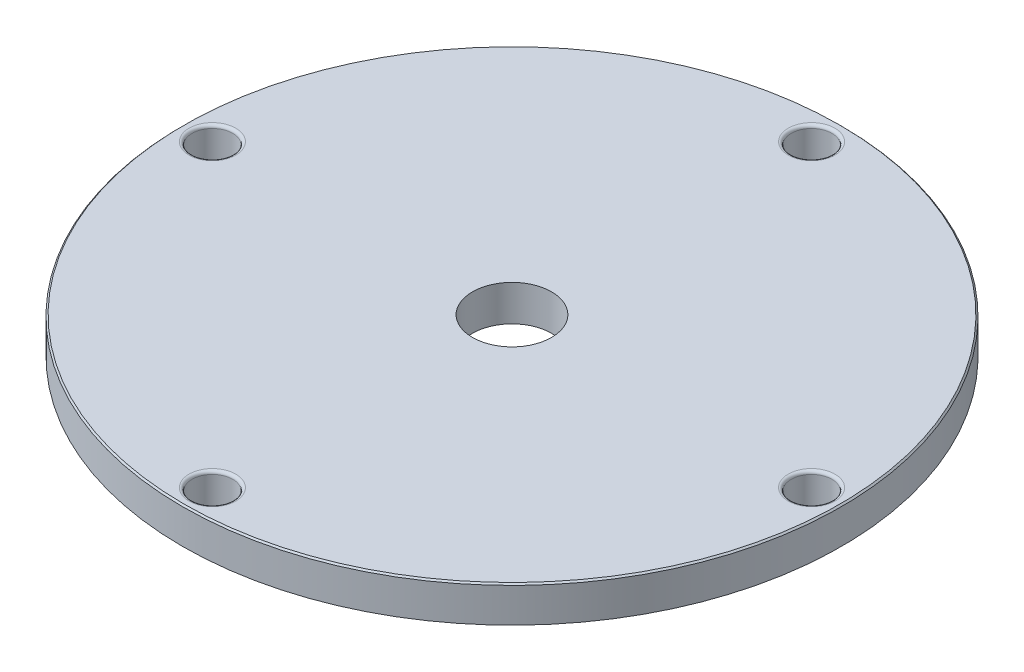
ISO-10303-21;
HEADER;
FILE_DESCRIPTION(('STEP AP214'),'2;1');
FILE_NAME('part.step','',(''),(''),'','','');
FILE_SCHEMA(('AUTOMOTIVE_DESIGN { 1 0 10303 214 1 1 1 1 }'));
ENDSEC;
DATA;
#1=APPLICATION_CONTEXT('core data for automotive mechanical design processes');
#2=APPLICATION_PROTOCOL_DEFINITION('international standard','automotive_design',2000,#1);
#3=PRODUCT_CONTEXT('',#1,'mechanical');
#4=PRODUCT('Part','Part','',(#3));
#5=PRODUCT_RELATED_PRODUCT_CATEGORY('part','',(#4));
#6=PRODUCT_DEFINITION_FORMATION('','',#4);
#7=PRODUCT_DEFINITION_CONTEXT('part definition',#1,'design');
#8=PRODUCT_DEFINITION('design','',#6,#7);
#9=PRODUCT_DEFINITION_SHAPE('','',#8);
#10=(LENGTH_UNIT() NAMED_UNIT(*) SI_UNIT(.MILLI.,.METRE.));
#11=(NAMED_UNIT(*) PLANE_ANGLE_UNIT() SI_UNIT($,.RADIAN.));
#12=(NAMED_UNIT(*) SI_UNIT($,.STERADIAN.) SOLID_ANGLE_UNIT());
#13=UNCERTAINTY_MEASURE_WITH_UNIT(LENGTH_MEASURE(1.E-05),#10,'distance_accuracy_value','');
#14=(GEOMETRIC_REPRESENTATION_CONTEXT(3) GLOBAL_UNCERTAINTY_ASSIGNED_CONTEXT((#13)) GLOBAL_UNIT_ASSIGNED_CONTEXT((#10,
#11,#12)) REPRESENTATION_CONTEXT('',''));
#15=CARTESIAN_POINT('',(0.,0.,0.));
#16=DIRECTION('',(0.,0.,1.));
#17=DIRECTION('',(1.,0.,0.));
#18=AXIS2_PLACEMENT_3D('',#15,#16,#17);
#19=CARTESIAN_POINT('',(0.,3.,0.));
#20=DIRECTION('',(0.,-1.,0.));
#21=DIRECTION('',(0.,0.,-1.));
#22=AXIS2_PLACEMENT_3D('',#19,#20,#21);
#23=CYLINDRICAL_SURFACE('',#22,3.3);
#24=CARTESIAN_POINT('',(0.,3.,0.));
#25=DIRECTION('',(0.,1.,0.));
#26=DIRECTION('',(0.,0.,1.));
#27=AXIS2_PLACEMENT_3D('',#24,#25,#26);
#28=CIRCLE('',#27,3.3);
#29=CARTESIAN_POINT('',(0.,3.,3.3));
#30=VERTEX_POINT('',#29);
#31=EDGE_CURVE('E86',#30,#30,#28,.T.);
#32=ORIENTED_EDGE('',*,*,#31,.T.);
#33=EDGE_LOOP('',(#32));
#34=FACE_BOUND('',#33,.T.);
#35=CARTESIAN_POINT('',(0.,0.,0.));
#36=DIRECTION('',(0.,1.,0.));
#37=DIRECTION('',(0.,0.,1.));
#38=AXIS2_PLACEMENT_3D('',#35,#36,#37);
#39=CIRCLE('',#38,3.3);
#40=CARTESIAN_POINT('',(0.,0.,3.3));
#41=VERTEX_POINT('',#40);
#42=EDGE_CURVE('E91',#41,#41,#39,.T.);
#43=ORIENTED_EDGE('',*,*,#42,.F.);
#44=EDGE_LOOP('',(#43));
#45=FACE_BOUND('',#44,.T.);
#46=ADVANCED_FACE('F38',(#34,#45),#23,.F.);
#47=CARTESIAN_POINT('',(0.,3.,0.));
#48=DIRECTION('',(0.,-1.,0.));
#49=DIRECTION('',(0.,0.,-1.));
#50=AXIS2_PLACEMENT_3D('',#47,#48,#49);
#51=CYLINDRICAL_SURFACE('',#50,27.5);
#52=CARTESIAN_POINT('',(0.,2.87500000000001,0.));
#53=DIRECTION('',(0.,1.,0.));
#54=DIRECTION('',(0.,0.,1.));
#55=AXIS2_PLACEMENT_3D('',#52,#53,#54);
#56=CIRCLE('',#55,27.5);
#57=CARTESIAN_POINT('',(0.,2.87500000000001,27.5));
#58=VERTEX_POINT('',#57);
#59=EDGE_CURVE('E78',#58,#58,#56,.F.);
#60=ORIENTED_EDGE('',*,*,#59,.T.);
#61=EDGE_LOOP('',(#60));
#62=FACE_BOUND('',#61,.T.);
#63=CARTESIAN_POINT('',(0.,0.,0.));
#64=DIRECTION('',(0.,1.,0.));
#65=DIRECTION('',(0.,0.,1.));
#66=AXIS2_PLACEMENT_3D('',#63,#64,#65);
#67=CIRCLE('',#66,27.5);
#68=CARTESIAN_POINT('',(0.,0.,27.5));
#69=VERTEX_POINT('',#68);
#70=EDGE_CURVE('E87',#69,#69,#67,.T.);
#71=ORIENTED_EDGE('',*,*,#70,.T.);
#72=EDGE_LOOP('',(#71));
#73=FACE_BOUND('',#72,.T.);
#74=ADVANCED_FACE('F135',(#62,#73),#51,.T.);
#75=CARTESIAN_POINT('',(0.,3.,0.));
#76=DIRECTION('',(0.,1.,0.));
#77=DIRECTION('',(0.,0.,1.));
#78=AXIS2_PLACEMENT_3D('',#75,#76,#77);
#79=PLANE('',#78);
#80=CARTESIAN_POINT('',(-24.9999999999993,3.,7.09011927261166E-13));
#81=DIRECTION('',(0.,1.,0.));
#82=DIRECTION('',(0.,0.,1.));
#83=AXIS2_PLACEMENT_3D('',#80,#81,#82);
#84=CIRCLE('',#83,1.95000000000113);
#85=CARTESIAN_POINT('',(-24.9999999999993,3.,1.95000000000184));
#86=VERTEX_POINT('',#85);
#87=EDGE_CURVE('E56',#86,#86,#84,.F.);
#88=ORIENTED_EDGE('',*,*,#87,.T.);
#89=EDGE_LOOP('',(#88));
#90=FACE_BOUND('',#89,.T.);
#91=CARTESIAN_POINT('',(1.4119006205266E-12,3.,25.));
#92=DIRECTION('',(0.,1.,0.));
#93=DIRECTION('',(0.,0.,1.));
#94=AXIS2_PLACEMENT_3D('',#91,#92,#93);
#95=CIRCLE('',#94,1.95000000000152);
#96=CARTESIAN_POINT('',(1.4119006205266E-12,3.,26.9500000000015));
#97=VERTEX_POINT('',#96);
#98=EDGE_CURVE('E62',#97,#97,#95,.F.);
#99=ORIENTED_EDGE('',*,*,#98,.T.);
#100=EDGE_LOOP('',(#99));
#101=FACE_BOUND('',#100,.T.);
#102=CARTESIAN_POINT('',(25.0000000000007,3.,-7.05950310263298E-13));
#103=DIRECTION('',(0.,1.,0.));
#104=DIRECTION('',(0.,0.,1.));
#105=AXIS2_PLACEMENT_3D('',#102,#103,#104);
#106=CIRCLE('',#105,1.95000000000055);
#107=CARTESIAN_POINT('',(25.0000000000007,3.,1.94999999999985));
#108=VERTEX_POINT('',#107);
#109=EDGE_CURVE('E66',#108,#108,#106,.F.);
#110=ORIENTED_EDGE('',*,*,#109,.T.);
#111=EDGE_LOOP('',(#110));
#112=FACE_BOUND('',#111,.T.);
#113=CARTESIAN_POINT('',(0.,3.,-25.));
#114=DIRECTION('',(0.,1.,0.));
#115=DIRECTION('',(0.,0.,1.));
#116=AXIS2_PLACEMENT_3D('',#113,#114,#115);
#117=CIRCLE('',#116,1.95);
#118=CARTESIAN_POINT('',(0.,3.,-23.05));
#119=VERTEX_POINT('',#118);
#120=EDGE_CURVE('E70',#119,#119,#117,.F.);
#121=ORIENTED_EDGE('',*,*,#120,.T.);
#122=EDGE_LOOP('',(#121));
#123=FACE_BOUND('',#122,.T.);
#124=CARTESIAN_POINT('',(0.,3.,0.));
#125=DIRECTION('',(0.,1.,0.));
#126=DIRECTION('',(0.,0.,1.));
#127=AXIS2_PLACEMENT_3D('',#124,#125,#126);
#128=CIRCLE('',#127,27.375);
#129=CARTESIAN_POINT('',(0.,3.,27.375));
#130=VERTEX_POINT('',#129);
#131=EDGE_CURVE('E82',#130,#130,#128,.T.);
#132=ORIENTED_EDGE('',*,*,#131,.T.);
#133=EDGE_LOOP('',(#132));
#134=FACE_BOUND('',#133,.T.);
#135=ORIENTED_EDGE('',*,*,#31,.F.);
#136=EDGE_LOOP('',(#135));
#137=FACE_BOUND('',#136,.T.);
#138=ADVANCED_FACE('F141',(#90,#101,#112,#123,#134,#137),#79,.T.);
#139=CARTESIAN_POINT('',(0.,0.,0.));
#140=DIRECTION('',(0.,1.,0.));
#141=DIRECTION('',(0.,0.,1.));
#142=AXIS2_PLACEMENT_3D('',#139,#140,#141);
#143=PLANE('',#142);
#144=CARTESIAN_POINT('',(-24.9999999999993,0.,7.09011927261166E-13));
#145=DIRECTION('',(0.,1.,0.));
#146=DIRECTION('',(0.,0.,1.));
#147=AXIS2_PLACEMENT_3D('',#144,#145,#146);
#148=CIRCLE('',#147,1.70000000000113);
#149=CARTESIAN_POINT('',(-24.9999999999993,0.,1.70000000000184));
#150=VERTEX_POINT('',#149);
#151=EDGE_CURVE('E95',#150,#150,#148,.T.);
#152=ORIENTED_EDGE('',*,*,#151,.T.);
#153=EDGE_LOOP('',(#152));
#154=FACE_BOUND('',#153,.T.);
#155=CARTESIAN_POINT('',(1.4119006205266E-12,0.,25.));
#156=DIRECTION('',(0.,1.,0.));
#157=DIRECTION('',(0.,0.,1.));
#158=AXIS2_PLACEMENT_3D('',#155,#156,#157);
#159=CIRCLE('',#158,1.70000000000152);
#160=CARTESIAN_POINT('',(1.4119006205266E-12,0.,26.7000000000015));
#161=VERTEX_POINT('',#160);
#162=EDGE_CURVE('E107',#161,#161,#159,.T.);
#163=ORIENTED_EDGE('',*,*,#162,.T.);
#164=EDGE_LOOP('',(#163));
#165=FACE_BOUND('',#164,.T.);
#166=CARTESIAN_POINT('',(25.0000000000007,0.,-7.05950310263298E-13));
#167=DIRECTION('',(0.,1.,0.));
#168=DIRECTION('',(0.,0.,1.));
#169=AXIS2_PLACEMENT_3D('',#166,#167,#168);
#170=CIRCLE('',#169,1.70000000000055);
#171=CARTESIAN_POINT('',(25.0000000000007,0.,1.69999999999985));
#172=VERTEX_POINT('',#171);
#173=EDGE_CURVE('E103',#172,#172,#170,.T.);
#174=ORIENTED_EDGE('',*,*,#173,.T.);
#175=EDGE_LOOP('',(#174));
#176=FACE_BOUND('',#175,.T.);
#177=CARTESIAN_POINT('',(0.,0.,-25.));
#178=DIRECTION('',(0.,1.,0.));
#179=DIRECTION('',(0.,0.,1.));
#180=AXIS2_PLACEMENT_3D('',#177,#178,#179);
#181=CIRCLE('',#180,1.7);
#182=CARTESIAN_POINT('',(0.,0.,-23.3));
#183=VERTEX_POINT('',#182);
#184=EDGE_CURVE('E99',#183,#183,#181,.T.);
#185=ORIENTED_EDGE('',*,*,#184,.T.);
#186=EDGE_LOOP('',(#185));
#187=FACE_BOUND('',#186,.T.);
#188=ORIENTED_EDGE('',*,*,#42,.T.);
#189=EDGE_LOOP('',(#188));
#190=FACE_BOUND('',#189,.T.);
#191=ORIENTED_EDGE('',*,*,#70,.F.);
#192=EDGE_LOOP('',(#191));
#193=FACE_BOUND('',#192,.T.);
#194=ADVANCED_FACE('F115',(#154,#165,#176,#187,#190,#193),#143,.F.);
#195=CARTESIAN_POINT('',(0.,0.,-25.));
#196=DIRECTION('',(0.,1.,0.));
#197=DIRECTION('',(0.,0.,1.));
#198=AXIS2_PLACEMENT_3D('',#195,#196,#197);
#199=CYLINDRICAL_SURFACE('',#198,1.7);
#200=CARTESIAN_POINT('',(0.,2.75,-25.));
#201=DIRECTION('',(0.,1.,0.));
#202=DIRECTION('',(0.,0.,1.));
#203=AXIS2_PLACEMENT_3D('',#200,#201,#202);
#204=CIRCLE('',#203,1.7);
#205=CARTESIAN_POINT('',(0.,2.75,-23.3));
#206=VERTEX_POINT('',#205);
#207=EDGE_CURVE('E10',#206,#206,#204,.T.);
#208=ORIENTED_EDGE('',*,*,#207,.T.);
#209=EDGE_LOOP('',(#208));
#210=FACE_BOUND('',#209,.T.);
#211=ORIENTED_EDGE('',*,*,#184,.F.);
#212=EDGE_LOOP('',(#211));
#213=FACE_BOUND('',#212,.T.);
#214=ADVANCED_FACE('F180',(#210,#213),#199,.F.);
#215=CARTESIAN_POINT('',(25.0000000000007,0.,-7.05950310263298E-13));
#216=DIRECTION('',(0.,1.,0.));
#217=DIRECTION('',(0.,0.,1.));
#218=AXIS2_PLACEMENT_3D('',#215,#216,#217);
#219=CYLINDRICAL_SURFACE('',#218,1.70000000000055);
#220=CARTESIAN_POINT('',(25.0000000000007,2.75,-7.05950310263298E-13));
#221=DIRECTION('',(0.,1.,0.));
#222=DIRECTION('',(0.,0.,1.));
#223=AXIS2_PLACEMENT_3D('',#220,#221,#222);
#224=CIRCLE('',#223,1.70000000000055);
#225=CARTESIAN_POINT('',(25.0000000000007,2.75,1.69999999999985));
#226=VERTEX_POINT('',#225);
#227=EDGE_CURVE('E46',#226,#226,#224,.T.);
#228=ORIENTED_EDGE('',*,*,#227,.T.);
#229=EDGE_LOOP('',(#228));
#230=FACE_BOUND('',#229,.T.);
#231=ORIENTED_EDGE('',*,*,#173,.F.);
#232=EDGE_LOOP('',(#231));
#233=FACE_BOUND('',#232,.T.);
#234=ADVANCED_FACE('F131',(#230,#233),#219,.F.);
#235=CARTESIAN_POINT('',(1.4119006205266E-12,0.,25.));
#236=DIRECTION('',(0.,1.,0.));
#237=DIRECTION('',(0.,0.,1.));
#238=AXIS2_PLACEMENT_3D('',#235,#236,#237);
#239=CYLINDRICAL_SURFACE('',#238,1.70000000000152);
#240=CARTESIAN_POINT('',(1.4119006205266E-12,2.75,25.));
#241=DIRECTION('',(0.,1.,0.));
#242=DIRECTION('',(0.,0.,1.));
#243=AXIS2_PLACEMENT_3D('',#240,#241,#242);
#244=CIRCLE('',#243,1.70000000000152);
#245=CARTESIAN_POINT('',(1.4119006205266E-12,2.75,26.7000000000015));
#246=VERTEX_POINT('',#245);
#247=EDGE_CURVE('E51',#246,#246,#244,.T.);
#248=ORIENTED_EDGE('',*,*,#247,.T.);
#249=EDGE_LOOP('',(#248));
#250=FACE_BOUND('',#249,.T.);
#251=ORIENTED_EDGE('',*,*,#162,.F.);
#252=EDGE_LOOP('',(#251));
#253=FACE_BOUND('',#252,.T.);
#254=ADVANCED_FACE('F121',(#250,#253),#239,.F.);
#255=CARTESIAN_POINT('',(-24.9999999999993,0.,7.09011927261166E-13));
#256=DIRECTION('',(0.,1.,0.));
#257=DIRECTION('',(0.,0.,1.));
#258=AXIS2_PLACEMENT_3D('',#255,#256,#257);
#259=CYLINDRICAL_SURFACE('',#258,1.70000000000113);
#260=CARTESIAN_POINT('',(-24.9999999999993,2.75,7.09011927261166E-13));
#261=DIRECTION('',(0.,1.,0.));
#262=DIRECTION('',(0.,0.,1.));
#263=AXIS2_PLACEMENT_3D('',#260,#261,#262);
#264=CIRCLE('',#263,1.70000000000113);
#265=CARTESIAN_POINT('',(-24.9999999999993,2.75,1.70000000000184));
#266=VERTEX_POINT('',#265);
#267=EDGE_CURVE('E74',#266,#266,#264,.T.);
#268=ORIENTED_EDGE('',*,*,#267,.T.);
#269=EDGE_LOOP('',(#268));
#270=FACE_BOUND('',#269,.T.);
#271=ORIENTED_EDGE('',*,*,#151,.F.);
#272=EDGE_LOOP('',(#271));
#273=FACE_BOUND('',#272,.T.);
#274=ADVANCED_FACE('F118',(#270,#273),#259,.F.);
#275=CARTESIAN_POINT('',(0.,3.,0.));
#276=DIRECTION('',(0.,-1.,0.));
#277=DIRECTION('',(0.,0.,-1.));
#278=AXIS2_PLACEMENT_3D('',#275,#276,#277);
#279=CONICAL_SURFACE('',#278,27.375,0.785398163397476);
#280=ORIENTED_EDGE('',*,*,#59,.F.);
#281=EDGE_LOOP('',(#280));
#282=FACE_BOUND('',#281,.T.);
#283=ORIENTED_EDGE('',*,*,#131,.F.);
#284=EDGE_LOOP('',(#283));
#285=FACE_BOUND('',#284,.T.);
#286=ADVANCED_FACE('F120',(#282,#285),#279,.T.);
#287=CARTESIAN_POINT('',(-24.9999999999993,2.75,7.09011927261166E-13));
#288=DIRECTION('',(0.,1.,0.));
#289=DIRECTION('',(0.,0.,1.));
#290=AXIS2_PLACEMENT_3D('',#287,#288,#289);
#291=TOROIDAL_SURFACE('',#290,1.95000000000113,0.25);
#292=ORIENTED_EDGE('',*,*,#87,.F.);
#293=EDGE_LOOP('',(#292));
#294=FACE_BOUND('',#293,.T.);
#295=ORIENTED_EDGE('',*,*,#267,.F.);
#296=EDGE_LOOP('',(#295));
#297=FACE_BOUND('',#296,.T.);
#298=ADVANCED_FACE('F128',(#294,#297),#291,.T.);
#299=CARTESIAN_POINT('',(1.4119006205266E-12,2.75,25.));
#300=DIRECTION('',(0.,1.,0.));
#301=DIRECTION('',(0.,0.,1.));
#302=AXIS2_PLACEMENT_3D('',#299,#300,#301);
#303=TOROIDAL_SURFACE('',#302,1.95000000000152,0.25);
#304=ORIENTED_EDGE('',*,*,#98,.F.);
#305=EDGE_LOOP('',(#304));
#306=FACE_BOUND('',#305,.T.);
#307=ORIENTED_EDGE('',*,*,#247,.F.);
#308=EDGE_LOOP('',(#307));
#309=FACE_BOUND('',#308,.T.);
#310=ADVANCED_FACE('F152',(#306,#309),#303,.T.);
#311=CARTESIAN_POINT('',(25.0000000000007,2.75,-7.05950310263298E-13));
#312=DIRECTION('',(0.,1.,0.));
#313=DIRECTION('',(0.,0.,1.));
#314=AXIS2_PLACEMENT_3D('',#311,#312,#313);
#315=TOROIDAL_SURFACE('',#314,1.95000000000055,0.25);
#316=ORIENTED_EDGE('',*,*,#109,.F.);
#317=EDGE_LOOP('',(#316));
#318=FACE_BOUND('',#317,.T.);
#319=ORIENTED_EDGE('',*,*,#227,.F.);
#320=EDGE_LOOP('',(#319));
#321=FACE_BOUND('',#320,.T.);
#322=ADVANCED_FACE('F155',(#318,#321),#315,.T.);
#323=CARTESIAN_POINT('',(0.,2.75,-25.));
#324=DIRECTION('',(0.,1.,0.));
#325=DIRECTION('',(0.,0.,1.));
#326=AXIS2_PLACEMENT_3D('',#323,#324,#325);
#327=TOROIDAL_SURFACE('',#326,1.95,0.25);
#328=ORIENTED_EDGE('',*,*,#120,.F.);
#329=EDGE_LOOP('',(#328));
#330=FACE_BOUND('',#329,.T.);
#331=ORIENTED_EDGE('',*,*,#207,.F.);
#332=EDGE_LOOP('',(#331));
#333=FACE_BOUND('',#332,.T.);
#334=ADVANCED_FACE('F40',(#330,#333),#327,.T.);
#335=CLOSED_SHELL('',(#46,#74,#138,#194,#214,#234,#254,#274,#286,#298,#310,#322,#334));
#336=MANIFOLD_SOLID_BREP('B2',#335);
#337=ADVANCED_BREP_SHAPE_REPRESENTATION('',(#18,#336),#14);
#338=SHAPE_DEFINITION_REPRESENTATION(#9,#337);
ENDSEC;
END-ISO-10303-21;
